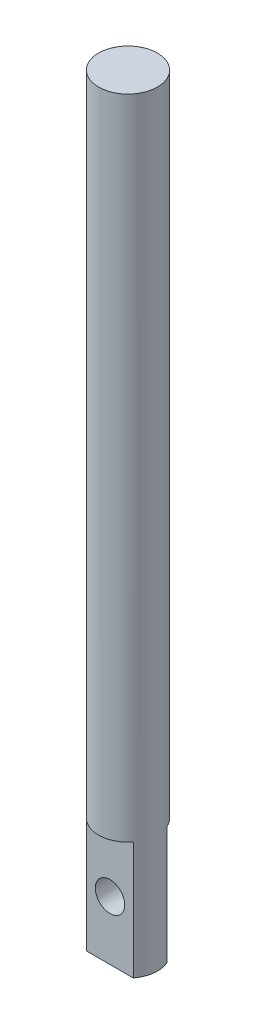
ISO-10303-21;
HEADER;
FILE_DESCRIPTION(('STEP AP214'),'2;1');
FILE_NAME('part.step','',(''),(''),'','','');
FILE_SCHEMA(('AUTOMOTIVE_DESIGN { 1 0 10303 214 1 1 1 1 }'));
ENDSEC;
DATA;
#1=APPLICATION_CONTEXT('core data for automotive mechanical design processes');
#2=APPLICATION_PROTOCOL_DEFINITION('international standard','automotive_design',2000,#1);
#3=PRODUCT_CONTEXT('',#1,'mechanical');
#4=PRODUCT('Part','Part','',(#3));
#5=PRODUCT_RELATED_PRODUCT_CATEGORY('part','',(#4));
#6=PRODUCT_DEFINITION_FORMATION('','',#4);
#7=PRODUCT_DEFINITION_CONTEXT('part definition',#1,'design');
#8=PRODUCT_DEFINITION('design','',#6,#7);
#9=PRODUCT_DEFINITION_SHAPE('','',#8);
#10=(LENGTH_UNIT() NAMED_UNIT(*) SI_UNIT(.MILLI.,.METRE.));
#11=(NAMED_UNIT(*) PLANE_ANGLE_UNIT() SI_UNIT($,.RADIAN.));
#12=(NAMED_UNIT(*) SI_UNIT($,.STERADIAN.) SOLID_ANGLE_UNIT());
#13=UNCERTAINTY_MEASURE_WITH_UNIT(LENGTH_MEASURE(1.E-05),#10,'distance_accuracy_value','');
#14=(GEOMETRIC_REPRESENTATION_CONTEXT(3) GLOBAL_UNCERTAINTY_ASSIGNED_CONTEXT((#13)) GLOBAL_UNIT_ASSIGNED_CONTEXT((#10,
#11,#12)) REPRESENTATION_CONTEXT('',''));
#15=CARTESIAN_POINT('',(0.,0.,0.));
#16=DIRECTION('',(0.,0.,1.));
#17=DIRECTION('',(1.,0.,0.));
#18=AXIS2_PLACEMENT_3D('',#15,#16,#17);
#19=CARTESIAN_POINT('',(0.,130.,0.));
#20=DIRECTION('',(0.,-1.,0.));
#21=DIRECTION('',(0.,0.,-1.));
#22=AXIS2_PLACEMENT_3D('',#19,#20,#21);
#23=CYLINDRICAL_SURFACE('',#22,5.);
#24=CARTESIAN_POINT('',(0.,130.,0.));
#25=DIRECTION('',(0.,1.,0.));
#26=DIRECTION('',(0.,0.,1.));
#27=AXIS2_PLACEMENT_3D('',#24,#25,#26);
#28=CIRCLE('',#27,5.);
#29=CARTESIAN_POINT('',(0.,130.,5.));
#30=VERTEX_POINT('',#29);
#31=EDGE_CURVE('E11',#30,#30,#28,.T.);
#32=ORIENTED_EDGE('',*,*,#31,.F.);
#33=EDGE_LOOP('',(#32));
#34=FACE_BOUND('',#33,.T.);
#35=CARTESIAN_POINT('',(0.,20.,0.));
#36=DIRECTION('',(0.,-1.,0.));
#37=DIRECTION('',(0.,0.,-1.));
#38=AXIS2_PLACEMENT_3D('',#35,#36,#37);
#39=CIRCLE('',#38,5.);
#40=CARTESIAN_POINT('',(3.95513796017631,20.,3.05890237110837));
#41=VERTEX_POINT('',#40);
#42=CARTESIAN_POINT('',(-3.9551379601763,20.,3.05890237110837));
#43=VERTEX_POINT('',#42);
#44=EDGE_CURVE('E76',#41,#43,#39,.T.);
#45=ORIENTED_EDGE('',*,*,#44,.F.);
#46=DIRECTION('',(0.,-1.,0.));
#47=VECTOR('',#46,1.);
#48=CARTESIAN_POINT('',(3.95513796017631,20.,3.05890237110837));
#49=LINE('',#48,#47);
#50=CARTESIAN_POINT('',(3.95513796017631,0.,3.05890237110837));
#51=VERTEX_POINT('',#50);
#52=EDGE_CURVE('E82',#41,#51,#49,.T.);
#53=ORIENTED_EDGE('',*,*,#52,.T.);
#54=CARTESIAN_POINT('',(0.,0.,0.));
#55=DIRECTION('',(0.,1.,0.));
#56=DIRECTION('',(0.,0.,1.));
#57=AXIS2_PLACEMENT_3D('',#54,#55,#56);
#58=CIRCLE('',#57,5.);
#59=CARTESIAN_POINT('',(4.58257569495584,0.,-2.));
#60=VERTEX_POINT('',#59);
#61=EDGE_CURVE('E55',#51,#60,#58,.T.);
#62=ORIENTED_EDGE('',*,*,#61,.T.);
#63=DIRECTION('',(0.,-1.,0.));
#64=VECTOR('',#63,1.);
#65=CARTESIAN_POINT('',(4.58257569495584,20.,-2.));
#66=LINE('',#65,#64);
#67=CARTESIAN_POINT('',(4.58257569495584,20.,-2.));
#68=VERTEX_POINT('',#67);
#69=EDGE_CURVE('E100',#68,#60,#66,.T.);
#70=ORIENTED_EDGE('',*,*,#69,.F.);
#71=CARTESIAN_POINT('',(0.,20.,0.));
#72=DIRECTION('',(0.,-1.,0.));
#73=DIRECTION('',(0.,0.,-1.));
#74=AXIS2_PLACEMENT_3D('',#71,#72,#73);
#75=CIRCLE('',#74,5.);
#76=CARTESIAN_POINT('',(-4.58257569495584,20.,-2.));
#77=VERTEX_POINT('',#76);
#78=EDGE_CURVE('E94',#77,#68,#75,.T.);
#79=ORIENTED_EDGE('',*,*,#78,.F.);
#80=DIRECTION('',(0.,-1.,0.));
#81=VECTOR('',#80,1.);
#82=CARTESIAN_POINT('',(-4.58257569495584,20.,-2.));
#83=LINE('',#82,#81);
#84=CARTESIAN_POINT('',(-4.58257569495584,0.,-2.));
#85=VERTEX_POINT('',#84);
#86=EDGE_CURVE('E97',#77,#85,#83,.T.);
#87=ORIENTED_EDGE('',*,*,#86,.T.);
#88=CARTESIAN_POINT('',(-3.95513796017631,0.,3.05890237110837));
#89=VERTEX_POINT('',#88);
#90=EDGE_CURVE('E36',#85,#89,#58,.T.);
#91=ORIENTED_EDGE('',*,*,#90,.T.);
#92=DIRECTION('',(0.,-1.,0.));
#93=VECTOR('',#92,1.);
#94=CARTESIAN_POINT('',(-3.9551379601763,20.,3.05890237110837));
#95=LINE('',#94,#93);
#96=EDGE_CURVE('E47',#43,#89,#95,.T.);
#97=ORIENTED_EDGE('',*,*,#96,.F.);
#98=EDGE_LOOP('',(#45,#53,#62,#70,#79,#87,#91,#97));
#99=FACE_BOUND('',#98,.T.);
#100=ADVANCED_FACE('F33',(#34,#99),#23,.T.);
#101=CARTESIAN_POINT('',(0.,0.,0.));
#102=DIRECTION('',(0.,1.,0.));
#103=DIRECTION('',(0.,0.,1.));
#104=AXIS2_PLACEMENT_3D('',#101,#102,#103);
#105=PLANE('',#104);
#106=ORIENTED_EDGE('',*,*,#61,.F.);
#107=DIRECTION('',(1.,0.,0.));
#108=VECTOR('',#107,1.);
#109=CARTESIAN_POINT('',(0.,0.,3.05890237110837));
#110=LINE('',#109,#108);
#111=EDGE_CURVE('E79',#89,#51,#110,.T.);
#112=ORIENTED_EDGE('',*,*,#111,.F.);
#113=ORIENTED_EDGE('',*,*,#90,.F.);
#114=DIRECTION('',(1.,0.,0.));
#115=VECTOR('',#114,1.);
#116=CARTESIAN_POINT('',(0.,0.,-2.));
#117=LINE('',#116,#115);
#118=EDGE_CURVE('E88',#85,#60,#117,.T.);
#119=ORIENTED_EDGE('',*,*,#118,.T.);
#120=EDGE_LOOP('',(#106,#112,#113,#119));
#121=FACE_BOUND('',#120,.T.);
#122=ADVANCED_FACE('F106',(#121),#105,.F.);
#123=CARTESIAN_POINT('',(0.,130.,0.));
#124=DIRECTION('',(0.,1.,0.));
#125=DIRECTION('',(0.,0.,1.));
#126=AXIS2_PLACEMENT_3D('',#123,#124,#125);
#127=PLANE('',#126);
#128=ORIENTED_EDGE('',*,*,#31,.T.);
#129=EDGE_LOOP('',(#128));
#130=FACE_BOUND('',#129,.T.);
#131=ADVANCED_FACE('F133',(#130),#127,.T.);
#132=CARTESIAN_POINT('',(0.,20.,-2.));
#133=DIRECTION('',(0.,0.,-1.));
#134=DIRECTION('',(-1.,0.,0.));
#135=AXIS2_PLACEMENT_3D('',#132,#133,#134);
#136=PLANE('',#135);
#137=CARTESIAN_POINT('',(0.0051379601763062,10.,-1.99999999999999));
#138=DIRECTION('',(0.,0.,-1.));
#139=DIRECTION('',(-1.,0.,0.));
#140=AXIS2_PLACEMENT_3D('',#137,#138,#139);
#141=CIRCLE('',#140,2.5);
#142=CARTESIAN_POINT('',(-2.4948620398237,10.,-2.));
#143=VERTEX_POINT('',#142);
#144=EDGE_CURVE('E107',#143,#143,#141,.T.);
#145=ORIENTED_EDGE('',*,*,#144,.F.);
#146=EDGE_LOOP('',(#145));
#147=FACE_BOUND('',#146,.T.);
#148=ORIENTED_EDGE('',*,*,#118,.F.);
#149=ORIENTED_EDGE('',*,*,#86,.F.);
#150=DIRECTION('',(1.,0.,0.));
#151=VECTOR('',#150,1.);
#152=CARTESIAN_POINT('',(0.,20.,-2.));
#153=LINE('',#152,#151);
#154=EDGE_CURVE('E92',#77,#68,#153,.T.);
#155=ORIENTED_EDGE('',*,*,#154,.T.);
#156=ORIENTED_EDGE('',*,*,#69,.T.);
#157=EDGE_LOOP('',(#148,#149,#155,#156));
#158=FACE_BOUND('',#157,.T.);
#159=ADVANCED_FACE('F125',(#147,#158),#136,.T.);
#160=CARTESIAN_POINT('',(0.,20.,0.));
#161=DIRECTION('',(0.,-1.,0.));
#162=DIRECTION('',(0.,0.,-1.));
#163=AXIS2_PLACEMENT_3D('',#160,#161,#162);
#164=PLANE('',#163);
#165=ORIENTED_EDGE('',*,*,#154,.F.);
#166=ORIENTED_EDGE('',*,*,#78,.T.);
#167=EDGE_LOOP('',(#165,#166));
#168=FACE_BOUND('',#167,.T.);
#169=ADVANCED_FACE('F118',(#168),#164,.T.);
#170=CARTESIAN_POINT('',(0.,20.,3.05890237110837));
#171=DIRECTION('',(0.,0.,-1.));
#172=DIRECTION('',(-1.,0.,0.));
#173=AXIS2_PLACEMENT_3D('',#170,#171,#172);
#174=PLANE('',#173);
#175=CARTESIAN_POINT('',(0.0051379601763062,10.,3.05890237110837));
#176=DIRECTION('',(0.,0.,1.));
#177=DIRECTION('',(1.,0.,0.));
#178=AXIS2_PLACEMENT_3D('',#175,#176,#177);
#179=CIRCLE('',#178,2.5);
#180=CARTESIAN_POINT('',(2.50513796017631,10.,3.05890237110837));
#181=VERTEX_POINT('',#180);
#182=EDGE_CURVE('E109',#181,#181,#179,.T.);
#183=ORIENTED_EDGE('',*,*,#182,.F.);
#184=EDGE_LOOP('',(#183));
#185=FACE_BOUND('',#184,.T.);
#186=ORIENTED_EDGE('',*,*,#111,.T.);
#187=ORIENTED_EDGE('',*,*,#52,.F.);
#188=DIRECTION('',(1.,0.,0.));
#189=VECTOR('',#188,1.);
#190=CARTESIAN_POINT('',(0.,20.,3.05890237110837));
#191=LINE('',#190,#189);
#192=EDGE_CURVE('E78',#43,#41,#191,.T.);
#193=ORIENTED_EDGE('',*,*,#192,.F.);
#194=ORIENTED_EDGE('',*,*,#96,.T.);
#195=EDGE_LOOP('',(#186,#187,#193,#194));
#196=FACE_BOUND('',#195,.T.);
#197=ADVANCED_FACE('F81',(#185,#196),#174,.F.);
#198=CARTESIAN_POINT('',(0.,20.,0.));
#199=DIRECTION('',(0.,-1.,0.));
#200=DIRECTION('',(0.,0.,-1.));
#201=AXIS2_PLACEMENT_3D('',#198,#199,#200);
#202=PLANE('',#201);
#203=ORIENTED_EDGE('',*,*,#44,.T.);
#204=ORIENTED_EDGE('',*,*,#192,.T.);
#205=EDGE_LOOP('',(#203,#204));
#206=FACE_BOUND('',#205,.T.);
#207=ADVANCED_FACE('F77',(#206),#202,.T.);
#208=CARTESIAN_POINT('',(0.0051379601763062,10.,-56.9410976288916));
#209=DIRECTION('',(0.,0.,1.));
#210=DIRECTION('',(1.,0.,0.));
#211=AXIS2_PLACEMENT_3D('',#208,#209,#210);
#212=CYLINDRICAL_SURFACE('',#211,2.5);
#213=ORIENTED_EDGE('',*,*,#144,.T.);
#214=EDGE_LOOP('',(#213));
#215=FACE_BOUND('',#214,.T.);
#216=ORIENTED_EDGE('',*,*,#182,.T.);
#217=EDGE_LOOP('',(#216));
#218=FACE_BOUND('',#217,.T.);
#219=ADVANCED_FACE('F115',(#215,#218),#212,.F.);
#220=CLOSED_SHELL('',(#100,#122,#131,#159,#169,#197,#207,#219));
#221=MANIFOLD_SOLID_BREP('B2',#220);
#222=ADVANCED_BREP_SHAPE_REPRESENTATION('',(#18,#221),#14);
#223=SHAPE_DEFINITION_REPRESENTATION(#9,#222);
ENDSEC;
END-ISO-10303-21;
